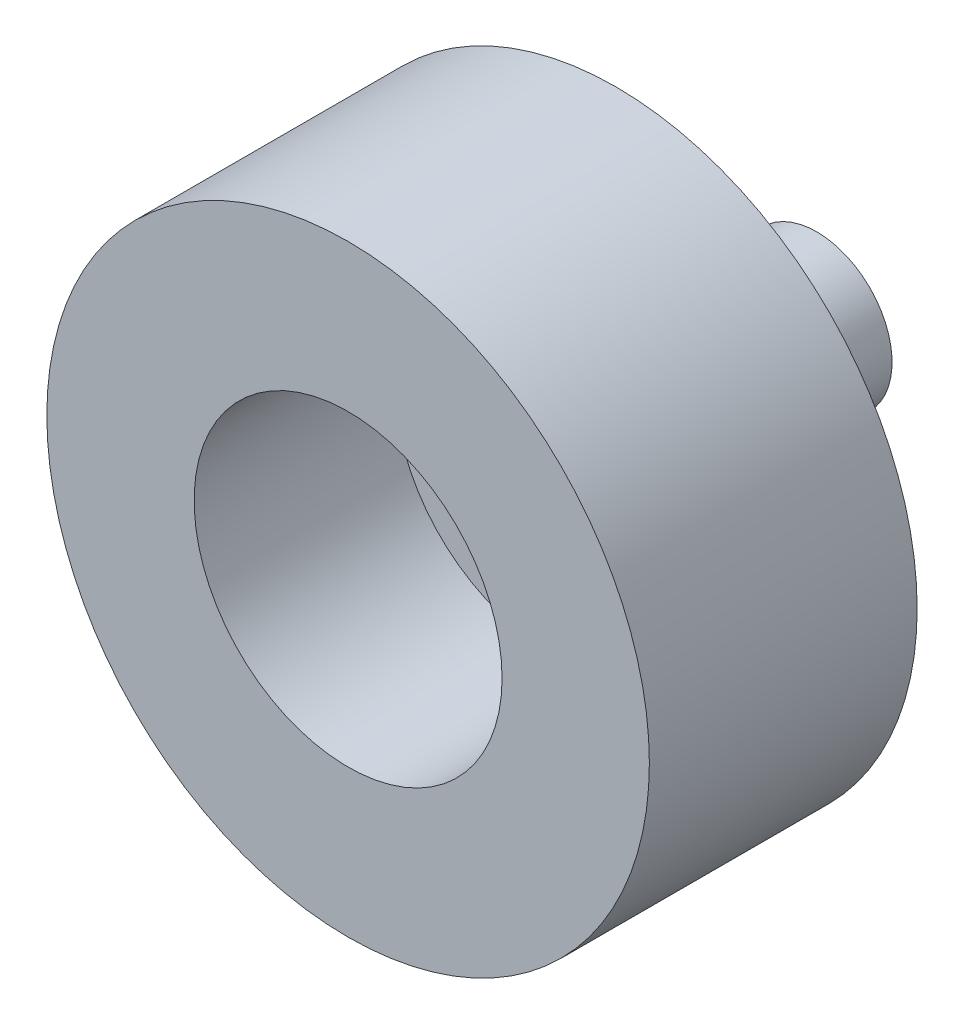
ISO-10303-21;
HEADER;
FILE_DESCRIPTION(('STEP AP214'),'2;1');
FILE_NAME('part.step','',(''),(''),'','','');
FILE_SCHEMA(('AUTOMOTIVE_DESIGN { 1 0 10303 214 1 1 1 1 }'));
ENDSEC;
DATA;
#1=APPLICATION_CONTEXT('core data for automotive mechanical design processes');
#2=APPLICATION_PROTOCOL_DEFINITION('international standard','automotive_design',2000,#1);
#3=PRODUCT_CONTEXT('',#1,'mechanical');
#4=PRODUCT('Part','Part','',(#3));
#5=PRODUCT_RELATED_PRODUCT_CATEGORY('part','',(#4));
#6=PRODUCT_DEFINITION_FORMATION('','',#4);
#7=PRODUCT_DEFINITION_CONTEXT('part definition',#1,'design');
#8=PRODUCT_DEFINITION('design','',#6,#7);
#9=PRODUCT_DEFINITION_SHAPE('','',#8);
#10=(LENGTH_UNIT() NAMED_UNIT(*) SI_UNIT(.MILLI.,.METRE.));
#11=(NAMED_UNIT(*) PLANE_ANGLE_UNIT() SI_UNIT($,.RADIAN.));
#12=(NAMED_UNIT(*) SI_UNIT($,.STERADIAN.) SOLID_ANGLE_UNIT());
#13=UNCERTAINTY_MEASURE_WITH_UNIT(LENGTH_MEASURE(1.E-05),#10,'distance_accuracy_value','');
#14=(GEOMETRIC_REPRESENTATION_CONTEXT(3) GLOBAL_UNCERTAINTY_ASSIGNED_CONTEXT((#13)) GLOBAL_UNIT_ASSIGNED_CONTEXT((#10,
#11,#12)) REPRESENTATION_CONTEXT('',''));
#15=CARTESIAN_POINT('',(0.,0.,0.));
#16=DIRECTION('',(0.,0.,1.));
#17=DIRECTION('',(1.,0.,0.));
#18=AXIS2_PLACEMENT_3D('',#15,#16,#17);
#19=CARTESIAN_POINT('',(0.,0.,1.));
#20=DIRECTION('',(0.,0.,-1.));
#21=DIRECTION('',(-1.,0.,0.));
#22=AXIS2_PLACEMENT_3D('',#19,#20,#21);
#23=CYLINDRICAL_SURFACE('',#22,4.5);
#24=CARTESIAN_POINT('',(0.,0.,0.));
#25=DIRECTION('',(0.,0.,1.));
#26=DIRECTION('',(1.,0.,0.));
#27=AXIS2_PLACEMENT_3D('',#24,#25,#26);
#28=CIRCLE('',#27,4.5);
#29=CARTESIAN_POINT('',(4.5,0.,0.));
#30=VERTEX_POINT('',#29);
#31=EDGE_CURVE('E45',#30,#30,#28,.T.);
#32=ORIENTED_EDGE('',*,*,#31,.T.);
#33=EDGE_LOOP('',(#32));
#34=FACE_BOUND('',#33,.T.);
#35=CARTESIAN_POINT('',(0.,0.,4.));
#36=DIRECTION('',(0.,0.,1.));
#37=DIRECTION('',(1.,0.,0.));
#38=AXIS2_PLACEMENT_3D('',#35,#36,#37);
#39=CIRCLE('',#38,4.5);
#40=CARTESIAN_POINT('',(4.5,0.,4.));
#41=VERTEX_POINT('',#40);
#42=EDGE_CURVE('E54',#41,#41,#39,.T.);
#43=ORIENTED_EDGE('',*,*,#42,.F.);
#44=EDGE_LOOP('',(#43));
#45=FACE_BOUND('',#44,.T.);
#46=ADVANCED_FACE('F35',(#34,#45),#23,.T.);
#47=CARTESIAN_POINT('',(0.,0.,0.));
#48=DIRECTION('',(0.,0.,1.));
#49=DIRECTION('',(1.,0.,0.));
#50=AXIS2_PLACEMENT_3D('',#47,#48,#49);
#51=PLANE('',#50);
#52=CARTESIAN_POINT('',(0.,0.,0.));
#53=DIRECTION('',(0.,0.,-1.));
#54=DIRECTION('',(-1.,0.,0.));
#55=AXIS2_PLACEMENT_3D('',#52,#53,#54);
#56=CIRCLE('',#55,1.125);
#57=CARTESIAN_POINT('',(-1.125,0.,0.));
#58=VERTEX_POINT('',#57);
#59=EDGE_CURVE('E41',#58,#58,#56,.T.);
#60=ORIENTED_EDGE('',*,*,#59,.F.);
#61=EDGE_LOOP('',(#60));
#62=FACE_BOUND('',#61,.T.);
#63=ORIENTED_EDGE('',*,*,#31,.F.);
#64=EDGE_LOOP('',(#63));
#65=FACE_BOUND('',#64,.T.);
#66=ADVANCED_FACE('F78',(#62,#65),#51,.F.);
#67=CARTESIAN_POINT('',(0.,0.,-3.));
#68=DIRECTION('',(0.,0.,1.));
#69=DIRECTION('',(1.,0.,0.));
#70=AXIS2_PLACEMENT_3D('',#67,#68,#69);
#71=CYLINDRICAL_SURFACE('',#70,1.125);
#72=CARTESIAN_POINT('',(0.,0.,-3.));
#73=DIRECTION('',(0.,0.,-1.));
#74=DIRECTION('',(-1.,0.,0.));
#75=AXIS2_PLACEMENT_3D('',#72,#73,#74);
#76=CIRCLE('',#75,1.125);
#77=CARTESIAN_POINT('',(-1.125,0.,-3.));
#78=VERTEX_POINT('',#77);
#79=EDGE_CURVE('E50',#78,#78,#76,.T.);
#80=ORIENTED_EDGE('',*,*,#79,.F.);
#81=EDGE_LOOP('',(#80));
#82=FACE_BOUND('',#81,.T.);
#83=ORIENTED_EDGE('',*,*,#59,.T.);
#84=EDGE_LOOP('',(#83));
#85=FACE_BOUND('',#84,.T.);
#86=ADVANCED_FACE('F74',(#82,#85),#71,.T.);
#87=CARTESIAN_POINT('',(0.,0.,-3.));
#88=DIRECTION('',(0.,0.,-1.));
#89=DIRECTION('',(-1.,0.,0.));
#90=AXIS2_PLACEMENT_3D('',#87,#88,#89);
#91=PLANE('',#90);
#92=ORIENTED_EDGE('',*,*,#79,.T.);
#93=EDGE_LOOP('',(#92));
#94=FACE_BOUND('',#93,.T.);
#95=ADVANCED_FACE('F65',(#94),#91,.T.);
#96=CARTESIAN_POINT('',(0.,0.,4.));
#97=DIRECTION('',(0.,0.,1.));
#98=DIRECTION('',(1.,0.,0.));
#99=AXIS2_PLACEMENT_3D('',#96,#97,#98);
#100=PLANE('',#99);
#101=ORIENTED_EDGE('',*,*,#42,.T.);
#102=EDGE_LOOP('',(#101));
#103=FACE_BOUND('',#102,.T.);
#104=CARTESIAN_POINT('',(0.,0.,4.));
#105=DIRECTION('',(0.,0.,1.));
#106=DIRECTION('',(1.,0.,0.));
#107=AXIS2_PLACEMENT_3D('',#104,#105,#106);
#108=CIRCLE('',#107,2.3);
#109=CARTESIAN_POINT('',(2.3,0.,4.));
#110=VERTEX_POINT('',#109);
#111=EDGE_CURVE('E57',#110,#110,#108,.T.);
#112=ORIENTED_EDGE('',*,*,#111,.F.);
#113=EDGE_LOOP('',(#112));
#114=FACE_BOUND('',#113,.T.);
#115=ADVANCED_FACE('F63',(#103,#114),#100,.T.);
#116=CARTESIAN_POINT('',(0.,0.,4.));
#117=DIRECTION('',(0.,0.,-1.));
#118=DIRECTION('',(-1.,0.,0.));
#119=AXIS2_PLACEMENT_3D('',#116,#117,#118);
#120=CYLINDRICAL_SURFACE('',#119,2.3);
#121=ORIENTED_EDGE('',*,*,#111,.T.);
#122=EDGE_LOOP('',(#121));
#123=FACE_BOUND('',#122,.T.);
#124=CARTESIAN_POINT('',(0.,0.,1.));
#125=DIRECTION('',(0.,0.,1.));
#126=DIRECTION('',(1.,0.,0.));
#127=AXIS2_PLACEMENT_3D('',#124,#125,#126);
#128=CIRCLE('',#127,2.3);
#129=CARTESIAN_POINT('',(2.3,0.,1.));
#130=VERTEX_POINT('',#129);
#131=EDGE_CURVE('E10',#130,#130,#128,.F.);
#132=ORIENTED_EDGE('',*,*,#131,.T.);
#133=EDGE_LOOP('',(#132));
#134=FACE_BOUND('',#133,.T.);
#135=ADVANCED_FACE('F61',(#123,#134),#120,.F.);
#136=CARTESIAN_POINT('',(0.,0.,1.));
#137=DIRECTION('',(0.,0.,1.));
#138=DIRECTION('',(1.,0.,0.));
#139=AXIS2_PLACEMENT_3D('',#136,#137,#138);
#140=PLANE('',#139);
#141=ORIENTED_EDGE('',*,*,#131,.F.);
#142=EDGE_LOOP('',(#141));
#143=FACE_BOUND('',#142,.T.);
#144=ADVANCED_FACE('F72',(#143),#140,.T.);
#145=CLOSED_SHELL('',(#46,#66,#86,#95,#115,#135,#144));
#146=MANIFOLD_SOLID_BREP('B2',#145);
#147=ADVANCED_BREP_SHAPE_REPRESENTATION('',(#18,#146),#14);
#148=SHAPE_DEFINITION_REPRESENTATION(#9,#147);
ENDSEC;
END-ISO-10303-21;
